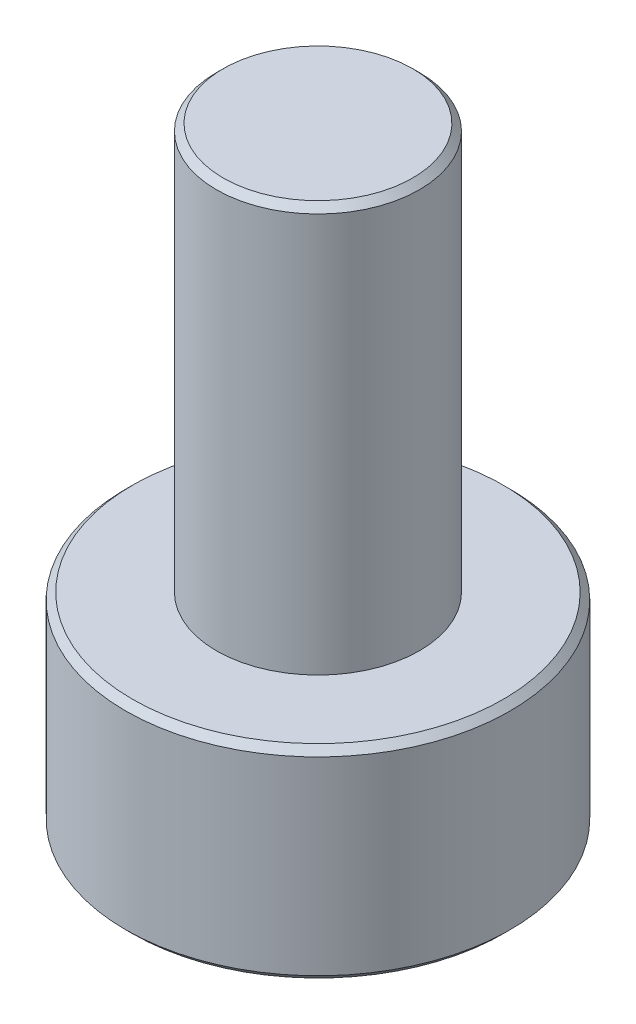
ISO-10303-21;
HEADER;
FILE_DESCRIPTION(('STEP AP214'),'2;1');
FILE_NAME('part.step','',(''),(''),'','','');
FILE_SCHEMA(('AUTOMOTIVE_DESIGN { 1 0 10303 214 1 1 1 1 }'));
ENDSEC;
DATA;
#1=APPLICATION_CONTEXT('core data for automotive mechanical design processes');
#2=APPLICATION_PROTOCOL_DEFINITION('international standard','automotive_design',2000,#1);
#3=PRODUCT_CONTEXT('',#1,'mechanical');
#4=PRODUCT('Part','Part','',(#3));
#5=PRODUCT_RELATED_PRODUCT_CATEGORY('part','',(#4));
#6=PRODUCT_DEFINITION_FORMATION('','',#4);
#7=PRODUCT_DEFINITION_CONTEXT('part definition',#1,'design');
#8=PRODUCT_DEFINITION('design','',#6,#7);
#9=PRODUCT_DEFINITION_SHAPE('','',#8);
#10=(LENGTH_UNIT() NAMED_UNIT(*) SI_UNIT(.MILLI.,.METRE.));
#11=(NAMED_UNIT(*) PLANE_ANGLE_UNIT() SI_UNIT($,.RADIAN.));
#12=(NAMED_UNIT(*) SI_UNIT($,.STERADIAN.) SOLID_ANGLE_UNIT());
#13=UNCERTAINTY_MEASURE_WITH_UNIT(LENGTH_MEASURE(1.E-05),#10,'distance_accuracy_value','');
#14=(GEOMETRIC_REPRESENTATION_CONTEXT(3) GLOBAL_UNCERTAINTY_ASSIGNED_CONTEXT((#13)) GLOBAL_UNIT_ASSIGNED_CONTEXT((#10,
#11,#12)) REPRESENTATION_CONTEXT('',''));
#15=CARTESIAN_POINT('',(0.,0.,0.));
#16=DIRECTION('',(0.,0.,1.));
#17=DIRECTION('',(1.,0.,0.));
#18=AXIS2_PLACEMENT_3D('',#15,#16,#17);
#19=CARTESIAN_POINT('',(0.,3.,0.));
#20=DIRECTION('',(0.,-1.,0.));
#21=DIRECTION('',(0.,0.,-1.));
#22=AXIS2_PLACEMENT_3D('',#19,#20,#21);
#23=CYLINDRICAL_SURFACE('',#22,2.84);
#24=CARTESIAN_POINT('',(0.,2.9,0.));
#25=DIRECTION('',(0.,1.,0.));
#26=DIRECTION('',(0.,0.,1.));
#27=AXIS2_PLACEMENT_3D('',#24,#25,#26);
#28=CIRCLE('',#27,2.84);
#29=CARTESIAN_POINT('',(0.,2.9,2.84));
#30=VERTEX_POINT('',#29);
#31=EDGE_CURVE('E52',#30,#30,#28,.F.);
#32=ORIENTED_EDGE('',*,*,#31,.T.);
#33=EDGE_LOOP('',(#32));
#34=FACE_BOUND('',#33,.T.);
#35=CARTESIAN_POINT('',(0.,0.100000000000001,0.));
#36=DIRECTION('',(0.,1.,0.));
#37=DIRECTION('',(0.,0.,1.));
#38=AXIS2_PLACEMENT_3D('',#35,#36,#37);
#39=CIRCLE('',#38,2.84);
#40=CARTESIAN_POINT('',(0.,0.100000000000001,2.84));
#41=VERTEX_POINT('',#40);
#42=EDGE_CURVE('E163',#41,#41,#39,.T.);
#43=ORIENTED_EDGE('',*,*,#42,.T.);
#44=EDGE_LOOP('',(#43));
#45=FACE_BOUND('',#44,.T.);
#46=ADVANCED_FACE('F44',(#34,#45),#23,.T.);
#47=CARTESIAN_POINT('',(0.,3.,0.));
#48=DIRECTION('',(0.,1.,0.));
#49=DIRECTION('',(0.,0.,1.));
#50=AXIS2_PLACEMENT_3D('',#47,#48,#49);
#51=PLANE('',#50);
#52=CARTESIAN_POINT('',(0.,3.,0.));
#53=DIRECTION('',(0.,1.,0.));
#54=DIRECTION('',(0.,0.,1.));
#55=AXIS2_PLACEMENT_3D('',#52,#53,#54);
#56=CIRCLE('',#55,2.74);
#57=CARTESIAN_POINT('',(0.,3.,2.74));
#58=VERTEX_POINT('',#57);
#59=EDGE_CURVE('E160',#58,#58,#56,.T.);
#60=ORIENTED_EDGE('',*,*,#59,.T.);
#61=EDGE_LOOP('',(#60));
#62=FACE_BOUND('',#61,.T.);
#63=CARTESIAN_POINT('',(0.,3.,0.));
#64=DIRECTION('',(0.,1.,0.));
#65=DIRECTION('',(0.,0.,1.));
#66=AXIS2_PLACEMENT_3D('',#63,#64,#65);
#67=CIRCLE('',#66,1.5);
#68=CARTESIAN_POINT('',(0.,3.,1.5));
#69=VERTEX_POINT('',#68);
#70=EDGE_CURVE('E146',#69,#69,#67,.T.);
#71=ORIENTED_EDGE('',*,*,#70,.F.);
#72=EDGE_LOOP('',(#71));
#73=FACE_BOUND('',#72,.T.);
#74=ADVANCED_FACE('F176',(#62,#73),#51,.T.);
#75=CARTESIAN_POINT('',(0.,0.,0.));
#76=DIRECTION('',(0.,1.,0.));
#77=DIRECTION('',(0.,0.,1.));
#78=AXIS2_PLACEMENT_3D('',#75,#76,#77);
#79=PLANE('',#78);
#80=CARTESIAN_POINT('',(0.,0.,0.));
#81=DIRECTION('',(0.,1.,0.));
#82=DIRECTION('',(0.,0.,1.));
#83=AXIS2_PLACEMENT_3D('',#80,#81,#82);
#84=CIRCLE('',#83,2.74);
#85=CARTESIAN_POINT('',(0.,0.,2.74));
#86=VERTEX_POINT('',#85);
#87=EDGE_CURVE('E11',#86,#86,#84,.F.);
#88=ORIENTED_EDGE('',*,*,#87,.T.);
#89=EDGE_LOOP('',(#88));
#90=FACE_BOUND('',#89,.T.);
#91=DIRECTION('',(0.,0.,1.));
#92=VECTOR('',#91,1.);
#93=CARTESIAN_POINT('',(1.29,0.,-0.744781847254618));
#94=LINE('',#93,#92);
#95=CARTESIAN_POINT('',(1.29,0.,-0.744781847254618));
#96=VERTEX_POINT('',#95);
#97=CARTESIAN_POINT('',(1.29,0.,0.744781847254619));
#98=VERTEX_POINT('',#97);
#99=EDGE_CURVE('E133',#96,#98,#94,.T.);
#100=ORIENTED_EDGE('',*,*,#99,.F.);
#101=DIRECTION('',(0.866025403784439,0.,0.5));
#102=VECTOR('',#101,1.);
#103=CARTESIAN_POINT('',(0.,0.,-1.48956369450924));
#104=LINE('',#103,#102);
#105=CARTESIAN_POINT('',(0.,0.,-1.48956369450924));
#106=VERTEX_POINT('',#105);
#107=EDGE_CURVE('E59',#106,#96,#104,.T.);
#108=ORIENTED_EDGE('',*,*,#107,.F.);
#109=DIRECTION('',(0.866025403784439,0.,-0.5));
#110=VECTOR('',#109,1.);
#111=CARTESIAN_POINT('',(-1.29,0.,-0.744781847254618));
#112=LINE('',#111,#110);
#113=CARTESIAN_POINT('',(-1.29,0.,-0.744781847254618));
#114=VERTEX_POINT('',#113);
#115=EDGE_CURVE('E142',#114,#106,#112,.T.);
#116=ORIENTED_EDGE('',*,*,#115,.F.);
#117=DIRECTION('',(0.,0.,-1.));
#118=VECTOR('',#117,1.);
#119=CARTESIAN_POINT('',(-1.29,0.,0.744781847254619));
#120=LINE('',#119,#118);
#121=CARTESIAN_POINT('',(-1.29,0.,0.744781847254619));
#122=VERTEX_POINT('',#121);
#123=EDGE_CURVE('E140',#122,#114,#120,.T.);
#124=ORIENTED_EDGE('',*,*,#123,.F.);
#125=DIRECTION('',(-0.866025403784439,0.,-0.5));
#126=VECTOR('',#125,1.);
#127=CARTESIAN_POINT('',(0.,0.,1.48956369450924));
#128=LINE('',#127,#126);
#129=CARTESIAN_POINT('',(0.,0.,1.48956369450924));
#130=VERTEX_POINT('',#129);
#131=EDGE_CURVE('E107',#130,#122,#128,.T.);
#132=ORIENTED_EDGE('',*,*,#131,.F.);
#133=DIRECTION('',(-0.866025403784439,0.,0.5));
#134=VECTOR('',#133,1.);
#135=CARTESIAN_POINT('',(1.29,0.,0.744781847254619));
#136=LINE('',#135,#134);
#137=EDGE_CURVE('E136',#98,#130,#136,.T.);
#138=ORIENTED_EDGE('',*,*,#137,.F.);
#139=EDGE_LOOP('',(#100,#108,#116,#124,#132,#138));
#140=FACE_BOUND('',#139,.T.);
#141=ADVANCED_FACE('F179',(#90,#140),#79,.F.);
#142=CARTESIAN_POINT('',(0.,9.,0.));
#143=DIRECTION('',(0.,-1.,0.));
#144=DIRECTION('',(0.,0.,-1.));
#145=AXIS2_PLACEMENT_3D('',#142,#143,#144);
#146=CYLINDRICAL_SURFACE('',#145,1.5);
#147=CARTESIAN_POINT('',(0.,8.9,0.));
#148=DIRECTION('',(0.,1.,0.));
#149=DIRECTION('',(0.,0.,1.));
#150=AXIS2_PLACEMENT_3D('',#147,#148,#149);
#151=CIRCLE('',#150,1.5);
#152=CARTESIAN_POINT('',(0.,8.9,1.5));
#153=VERTEX_POINT('',#152);
#154=EDGE_CURVE('E157',#153,#153,#151,.F.);
#155=ORIENTED_EDGE('',*,*,#154,.T.);
#156=EDGE_LOOP('',(#155));
#157=FACE_BOUND('',#156,.T.);
#158=ORIENTED_EDGE('',*,*,#70,.T.);
#159=EDGE_LOOP('',(#158));
#160=FACE_BOUND('',#159,.T.);
#161=ADVANCED_FACE('F183',(#157,#160),#146,.T.);
#162=CARTESIAN_POINT('',(0.,9.,0.));
#163=DIRECTION('',(0.,1.,0.));
#164=DIRECTION('',(0.,0.,1.));
#165=AXIS2_PLACEMENT_3D('',#162,#163,#164);
#166=PLANE('',#165);
#167=CARTESIAN_POINT('',(0.,9.,0.));
#168=DIRECTION('',(0.,1.,0.));
#169=DIRECTION('',(0.,0.,1.));
#170=AXIS2_PLACEMENT_3D('',#167,#168,#169);
#171=CIRCLE('',#170,1.4);
#172=CARTESIAN_POINT('',(0.,9.,1.4));
#173=VERTEX_POINT('',#172);
#174=EDGE_CURVE('E154',#173,#173,#171,.T.);
#175=ORIENTED_EDGE('',*,*,#174,.T.);
#176=EDGE_LOOP('',(#175));
#177=FACE_BOUND('',#176,.T.);
#178=ADVANCED_FACE('F185',(#177),#166,.T.);
#179=CARTESIAN_POINT('',(0.,1.3,-1.48956369450924));
#180=DIRECTION('',(0.5,0.,-0.866025403784439));
#181=DIRECTION('',(-0.866025403784439,0.,-0.5));
#182=AXIS2_PLACEMENT_3D('',#179,#180,#181);
#183=PLANE('',#182);
#184=ORIENTED_EDGE('',*,*,#107,.T.);
#185=DIRECTION('',(0.,-1.,0.));
#186=VECTOR('',#185,1.);
#187=CARTESIAN_POINT('',(1.29,1.3,-0.744781847254618));
#188=LINE('',#187,#186);
#189=CARTESIAN_POINT('',(1.29,1.3,-0.744781847254618));
#190=VERTEX_POINT('',#189);
#191=EDGE_CURVE('E89',#190,#96,#188,.T.);
#192=ORIENTED_EDGE('',*,*,#191,.F.);
#193=DIRECTION('',(0.866025403784439,0.,0.5));
#194=VECTOR('',#193,1.);
#195=CARTESIAN_POINT('',(0.,1.3,-1.48956369450924));
#196=LINE('',#195,#194);
#197=CARTESIAN_POINT('',(0.,1.3,-1.48956369450924));
#198=VERTEX_POINT('',#197);
#199=EDGE_CURVE('E144',#198,#190,#196,.T.);
#200=ORIENTED_EDGE('',*,*,#199,.F.);
#201=DIRECTION('',(0.,-1.,0.));
#202=VECTOR('',#201,1.);
#203=CARTESIAN_POINT('',(0.,1.3,-1.48956369450924));
#204=LINE('',#203,#202);
#205=EDGE_CURVE('E67',#198,#106,#204,.T.);
#206=ORIENTED_EDGE('',*,*,#205,.T.);
#207=EDGE_LOOP('',(#184,#192,#200,#206));
#208=FACE_BOUND('',#207,.T.);
#209=ADVANCED_FACE('F192',(#208),#183,.F.);
#210=CARTESIAN_POINT('',(-1.29,1.3,-0.744781847254618));
#211=DIRECTION('',(-0.5,0.,-0.866025403784439));
#212=DIRECTION('',(-0.866025403784439,0.,0.5));
#213=AXIS2_PLACEMENT_3D('',#210,#211,#212);
#214=PLANE('',#213);
#215=ORIENTED_EDGE('',*,*,#115,.T.);
#216=ORIENTED_EDGE('',*,*,#205,.F.);
#217=DIRECTION('',(0.866025403784439,0.,-0.5));
#218=VECTOR('',#217,1.);
#219=CARTESIAN_POINT('',(-1.29,1.3,-0.744781847254618));
#220=LINE('',#219,#218);
#221=CARTESIAN_POINT('',(-1.29,1.3,-0.744781847254618));
#222=VERTEX_POINT('',#221);
#223=EDGE_CURVE('E119',#222,#198,#220,.T.);
#224=ORIENTED_EDGE('',*,*,#223,.F.);
#225=DIRECTION('',(0.,-1.,0.));
#226=VECTOR('',#225,1.);
#227=CARTESIAN_POINT('',(-1.29,1.3,-0.744781847254618));
#228=LINE('',#227,#226);
#229=EDGE_CURVE('E111',#222,#114,#228,.T.);
#230=ORIENTED_EDGE('',*,*,#229,.T.);
#231=EDGE_LOOP('',(#215,#216,#224,#230));
#232=FACE_BOUND('',#231,.T.);
#233=ADVANCED_FACE('F219',(#232),#214,.F.);
#234=CARTESIAN_POINT('',(-1.29,1.3,0.744781847254619));
#235=DIRECTION('',(-1.,0.,0.));
#236=DIRECTION('',(0.,0.,1.));
#237=AXIS2_PLACEMENT_3D('',#234,#235,#236);
#238=PLANE('',#237);
#239=ORIENTED_EDGE('',*,*,#123,.T.);
#240=ORIENTED_EDGE('',*,*,#229,.F.);
#241=DIRECTION('',(0.,0.,-1.));
#242=VECTOR('',#241,1.);
#243=CARTESIAN_POINT('',(-1.29,1.3,0.744781847254619));
#244=LINE('',#243,#242);
#245=CARTESIAN_POINT('',(-1.29,1.3,0.744781847254619));
#246=VERTEX_POINT('',#245);
#247=EDGE_CURVE('E115',#246,#222,#244,.T.);
#248=ORIENTED_EDGE('',*,*,#247,.F.);
#249=DIRECTION('',(0.,-1.,0.));
#250=VECTOR('',#249,1.);
#251=CARTESIAN_POINT('',(-1.29,1.3,0.744781847254619));
#252=LINE('',#251,#250);
#253=EDGE_CURVE('E100',#246,#122,#252,.T.);
#254=ORIENTED_EDGE('',*,*,#253,.T.);
#255=EDGE_LOOP('',(#239,#240,#248,#254));
#256=FACE_BOUND('',#255,.T.);
#257=ADVANCED_FACE('F116',(#256),#238,.F.);
#258=CARTESIAN_POINT('',(0.,1.3,1.48956369450924));
#259=DIRECTION('',(-0.5,0.,0.866025403784439));
#260=DIRECTION('',(0.866025403784439,0.,0.5));
#261=AXIS2_PLACEMENT_3D('',#258,#259,#260);
#262=PLANE('',#261);
#263=ORIENTED_EDGE('',*,*,#131,.T.);
#264=ORIENTED_EDGE('',*,*,#253,.F.);
#265=DIRECTION('',(-0.866025403784439,0.,-0.5));
#266=VECTOR('',#265,1.);
#267=CARTESIAN_POINT('',(0.,1.3,1.48956369450924));
#268=LINE('',#267,#266);
#269=CARTESIAN_POINT('',(0.,1.3,1.48956369450924));
#270=VERTEX_POINT('',#269);
#271=EDGE_CURVE('E104',#270,#246,#268,.T.);
#272=ORIENTED_EDGE('',*,*,#271,.F.);
#273=DIRECTION('',(0.,-1.,0.));
#274=VECTOR('',#273,1.);
#275=CARTESIAN_POINT('',(0.,1.3,1.48956369450924));
#276=LINE('',#275,#274);
#277=EDGE_CURVE('E112',#270,#130,#276,.T.);
#278=ORIENTED_EDGE('',*,*,#277,.T.);
#279=EDGE_LOOP('',(#263,#264,#272,#278));
#280=FACE_BOUND('',#279,.T.);
#281=ADVANCED_FACE('F102',(#280),#262,.F.);
#282=CARTESIAN_POINT('',(1.29,1.3,0.744781847254619));
#283=DIRECTION('',(0.5,0.,0.866025403784439));
#284=DIRECTION('',(0.866025403784439,0.,-0.5));
#285=AXIS2_PLACEMENT_3D('',#282,#283,#284);
#286=PLANE('',#285);
#287=ORIENTED_EDGE('',*,*,#137,.T.);
#288=ORIENTED_EDGE('',*,*,#277,.F.);
#289=DIRECTION('',(-0.866025403784439,0.,0.5));
#290=VECTOR('',#289,1.);
#291=CARTESIAN_POINT('',(1.29,1.3,0.744781847254619));
#292=LINE('',#291,#290);
#293=CARTESIAN_POINT('',(1.29,1.3,0.744781847254619));
#294=VERTEX_POINT('',#293);
#295=EDGE_CURVE('E125',#294,#270,#292,.T.);
#296=ORIENTED_EDGE('',*,*,#295,.F.);
#297=DIRECTION('',(0.,-1.,0.));
#298=VECTOR('',#297,1.);
#299=CARTESIAN_POINT('',(1.29,1.3,0.744781847254619));
#300=LINE('',#299,#298);
#301=EDGE_CURVE('E149',#294,#98,#300,.T.);
#302=ORIENTED_EDGE('',*,*,#301,.T.);
#303=EDGE_LOOP('',(#287,#288,#296,#302));
#304=FACE_BOUND('',#303,.T.);
#305=ADVANCED_FACE('F215',(#304),#286,.F.);
#306=CARTESIAN_POINT('',(1.29,1.3,-0.744781847254618));
#307=DIRECTION('',(1.,0.,0.));
#308=DIRECTION('',(0.,0.,-1.));
#309=AXIS2_PLACEMENT_3D('',#306,#307,#308);
#310=PLANE('',#309);
#311=ORIENTED_EDGE('',*,*,#99,.T.);
#312=ORIENTED_EDGE('',*,*,#301,.F.);
#313=DIRECTION('',(0.,0.,1.));
#314=VECTOR('',#313,1.);
#315=CARTESIAN_POINT('',(1.29,1.3,-0.744781847254618));
#316=LINE('',#315,#314);
#317=EDGE_CURVE('E127',#190,#294,#316,.T.);
#318=ORIENTED_EDGE('',*,*,#317,.F.);
#319=ORIENTED_EDGE('',*,*,#191,.T.);
#320=EDGE_LOOP('',(#311,#312,#318,#319));
#321=FACE_BOUND('',#320,.T.);
#322=ADVANCED_FACE('F207',(#321),#310,.F.);
#323=CARTESIAN_POINT('',(0.,1.3,0.));
#324=DIRECTION('',(0.,-1.,0.));
#325=DIRECTION('',(0.,0.,-1.));
#326=AXIS2_PLACEMENT_3D('',#323,#324,#325);
#327=PLANE('',#326);
#328=ORIENTED_EDGE('',*,*,#199,.T.);
#329=ORIENTED_EDGE('',*,*,#317,.T.);
#330=ORIENTED_EDGE('',*,*,#295,.T.);
#331=ORIENTED_EDGE('',*,*,#271,.T.);
#332=ORIENTED_EDGE('',*,*,#247,.T.);
#333=ORIENTED_EDGE('',*,*,#223,.T.);
#334=EDGE_LOOP('',(#328,#329,#330,#331,#332,#333));
#335=FACE_BOUND('',#334,.T.);
#336=ADVANCED_FACE('F122',(#335),#327,.T.);
#337=CARTESIAN_POINT('',(0.,9.,0.));
#338=DIRECTION('',(0.,-1.,0.));
#339=DIRECTION('',(0.,0.,-1.));
#340=AXIS2_PLACEMENT_3D('',#337,#338,#339);
#341=CONICAL_SURFACE('',#340,1.4,0.785398163397453);
#342=ORIENTED_EDGE('',*,*,#154,.F.);
#343=EDGE_LOOP('',(#342));
#344=FACE_BOUND('',#343,.T.);
#345=ORIENTED_EDGE('',*,*,#174,.F.);
#346=EDGE_LOOP('',(#345));
#347=FACE_BOUND('',#346,.T.);
#348=ADVANCED_FACE('F173',(#344,#347),#341,.T.);
#349=CARTESIAN_POINT('',(0.,3.,0.));
#350=DIRECTION('',(0.,-1.,0.));
#351=DIRECTION('',(0.,0.,-1.));
#352=AXIS2_PLACEMENT_3D('',#349,#350,#351);
#353=CONICAL_SURFACE('',#352,2.74,0.785398163397448);
#354=ORIENTED_EDGE('',*,*,#31,.F.);
#355=EDGE_LOOP('',(#354));
#356=FACE_BOUND('',#355,.T.);
#357=ORIENTED_EDGE('',*,*,#59,.F.);
#358=EDGE_LOOP('',(#357));
#359=FACE_BOUND('',#358,.T.);
#360=ADVANCED_FACE('F170',(#356,#359),#353,.T.);
#361=CARTESIAN_POINT('',(0.,0.100000000000001,0.));
#362=DIRECTION('',(0.,1.,0.));
#363=DIRECTION('',(0.,0.,1.));
#364=AXIS2_PLACEMENT_3D('',#361,#362,#363);
#365=CONICAL_SURFACE('',#364,2.84,0.785398163397446);
#366=ORIENTED_EDGE('',*,*,#87,.F.);
#367=EDGE_LOOP('',(#366));
#368=FACE_BOUND('',#367,.T.);
#369=ORIENTED_EDGE('',*,*,#42,.F.);
#370=EDGE_LOOP('',(#369));
#371=FACE_BOUND('',#370,.T.);
#372=ADVANCED_FACE('F46',(#368,#371),#365,.T.);
#373=CLOSED_SHELL('',(#46,#74,#141,#161,#178,#209,#233,#257,#281,#305,#322,#336,#348,#360,#372));
#374=MANIFOLD_SOLID_BREP('B2',#373);
#375=ADVANCED_BREP_SHAPE_REPRESENTATION('',(#18,#374),#14);
#376=SHAPE_DEFINITION_REPRESENTATION(#9,#375);
ENDSEC;
END-ISO-10303-21;
